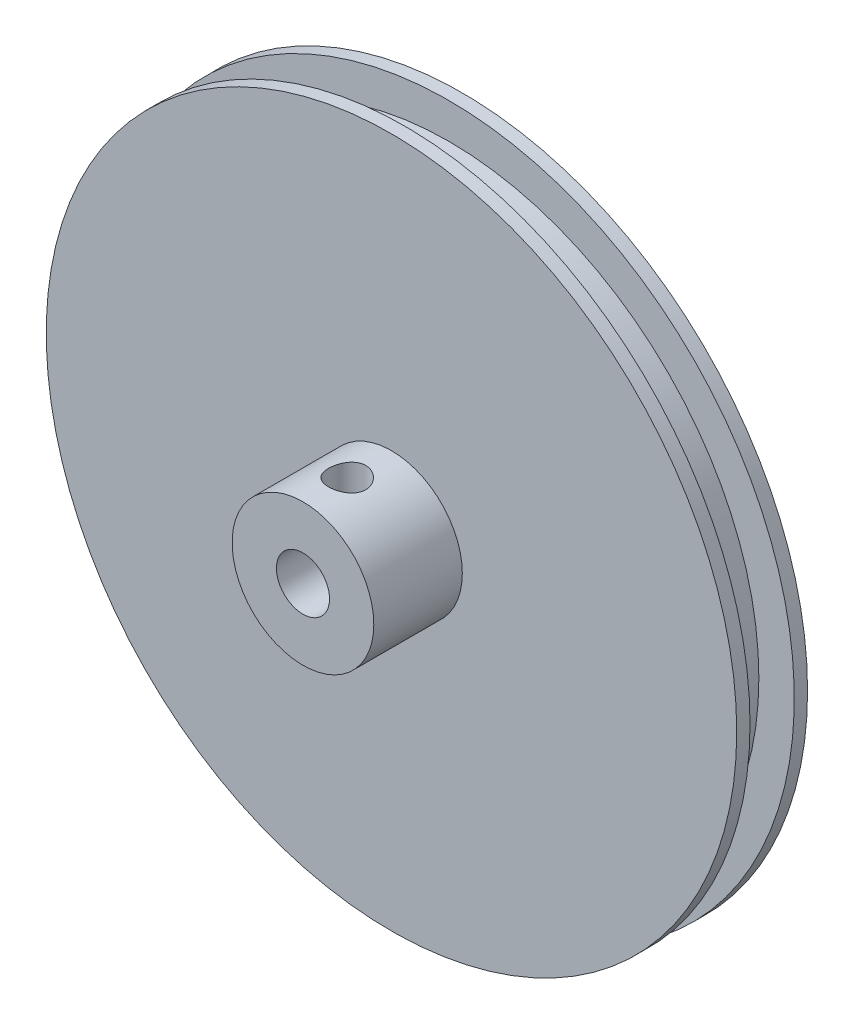
ISO-10303-21;
HEADER;
FILE_DESCRIPTION(('STEP AP214'),'2;1');
FILE_NAME('part.step','',(''),(''),'','','');
FILE_SCHEMA(('AUTOMOTIVE_DESIGN { 1 0 10303 214 1 1 1 1 }'));
ENDSEC;
DATA;
#1=APPLICATION_CONTEXT('core data for automotive mechanical design processes');
#2=APPLICATION_PROTOCOL_DEFINITION('international standard','automotive_design',2000,#1);
#3=PRODUCT_CONTEXT('',#1,'mechanical');
#4=PRODUCT('Part','Part','',(#3));
#5=PRODUCT_RELATED_PRODUCT_CATEGORY('part','',(#4));
#6=PRODUCT_DEFINITION_FORMATION('','',#4);
#7=PRODUCT_DEFINITION_CONTEXT('part definition',#1,'design');
#8=PRODUCT_DEFINITION('design','',#6,#7);
#9=PRODUCT_DEFINITION_SHAPE('','',#8);
#10=(LENGTH_UNIT() NAMED_UNIT(*) SI_UNIT(.MILLI.,.METRE.));
#11=(NAMED_UNIT(*) PLANE_ANGLE_UNIT() SI_UNIT($,.RADIAN.));
#12=(NAMED_UNIT(*) SI_UNIT($,.STERADIAN.) SOLID_ANGLE_UNIT());
#13=UNCERTAINTY_MEASURE_WITH_UNIT(LENGTH_MEASURE(1.E-05),#10,'distance_accuracy_value','');
#14=(GEOMETRIC_REPRESENTATION_CONTEXT(3) GLOBAL_UNCERTAINTY_ASSIGNED_CONTEXT((#13)) GLOBAL_UNIT_ASSIGNED_CONTEXT((#10,
#11,#12)) REPRESENTATION_CONTEXT('',''));
#15=CARTESIAN_POINT('',(0.,0.,0.));
#16=DIRECTION('',(0.,0.,1.));
#17=DIRECTION('',(1.,0.,0.));
#18=AXIS2_PLACEMENT_3D('',#15,#16,#17);
#19=CARTESIAN_POINT('',(0.,0.,8.));
#20=DIRECTION('',(0.,0.,-1.));
#21=DIRECTION('',(-1.,0.,0.));
#22=AXIS2_PLACEMENT_3D('',#19,#20,#21);
#23=CYLINDRICAL_SURFACE('',#22,39.);
#24=CARTESIAN_POINT('',(0.,0.,1.5));
#25=DIRECTION('',(0.,0.,-1.));
#26=DIRECTION('',(-1.,0.,0.));
#27=AXIS2_PLACEMENT_3D('',#24,#25,#26);
#28=CIRCLE('',#27,39.);
#29=CARTESIAN_POINT('',(-39.,0.,1.5));
#30=VERTEX_POINT('',#29);
#31=EDGE_CURVE('E55',#30,#30,#28,.T.);
#32=ORIENTED_EDGE('',*,*,#31,.T.);
#33=EDGE_LOOP('',(#32));
#34=FACE_BOUND('',#33,.T.);
#35=CARTESIAN_POINT('',(0.,0.,0.));
#36=DIRECTION('',(0.,0.,1.));
#37=DIRECTION('',(1.,0.,0.));
#38=AXIS2_PLACEMENT_3D('',#35,#36,#37);
#39=CIRCLE('',#38,39.);
#40=CARTESIAN_POINT('',(39.,0.,0.));
#41=VERTEX_POINT('',#40);
#42=EDGE_CURVE('E66',#41,#41,#39,.T.);
#43=ORIENTED_EDGE('',*,*,#42,.T.);
#44=EDGE_LOOP('',(#43));
#45=FACE_BOUND('',#44,.T.);
#46=ADVANCED_FACE('F51',(#34,#45),#23,.T.);
#47=CARTESIAN_POINT('',(0.,0.,6.5));
#48=DIRECTION('',(0.,0.,1.));
#49=DIRECTION('',(1.,0.,0.));
#50=AXIS2_PLACEMENT_3D('',#47,#48,#49);
#51=CIRCLE('',#50,39.);
#52=CARTESIAN_POINT('',(39.,0.,6.5));
#53=VERTEX_POINT('',#52);
#54=EDGE_CURVE('E74',#53,#53,#51,.T.);
#55=ORIENTED_EDGE('',*,*,#54,.T.);
#56=EDGE_LOOP('',(#55));
#57=FACE_BOUND('',#56,.T.);
#58=CARTESIAN_POINT('',(0.,0.,8.));
#59=DIRECTION('',(0.,0.,1.));
#60=DIRECTION('',(1.,0.,0.));
#61=AXIS2_PLACEMENT_3D('',#58,#59,#60);
#62=CIRCLE('',#61,39.);
#63=CARTESIAN_POINT('',(39.,0.,8.));
#64=VERTEX_POINT('',#63);
#65=EDGE_CURVE('E60',#64,#64,#62,.T.);
#66=ORIENTED_EDGE('',*,*,#65,.F.);
#67=EDGE_LOOP('',(#66));
#68=FACE_BOUND('',#67,.T.);
#69=ADVANCED_FACE('F53',(#57,#68),#23,.T.);
#70=CARTESIAN_POINT('',(0.,0.,8.));
#71=DIRECTION('',(0.,0.,1.));
#72=DIRECTION('',(1.,0.,0.));
#73=AXIS2_PLACEMENT_3D('',#70,#71,#72);
#74=PLANE('',#73);
#75=CARTESIAN_POINT('',(0.,0.,8.));
#76=DIRECTION('',(0.,0.,1.));
#77=DIRECTION('',(1.,0.,0.));
#78=AXIS2_PLACEMENT_3D('',#75,#76,#77);
#79=CIRCLE('',#78,8.);
#80=CARTESIAN_POINT('',(8.,0.,8.));
#81=VERTEX_POINT('',#80);
#82=EDGE_CURVE('E11',#81,#81,#79,.T.);
#83=ORIENTED_EDGE('',*,*,#82,.F.);
#84=EDGE_LOOP('',(#83));
#85=FACE_BOUND('',#84,.T.);
#86=ORIENTED_EDGE('',*,*,#65,.T.);
#87=EDGE_LOOP('',(#86));
#88=FACE_BOUND('',#87,.T.);
#89=ADVANCED_FACE('F135',(#85,#88),#74,.T.);
#90=CARTESIAN_POINT('',(0.,0.,0.));
#91=DIRECTION('',(0.,0.,1.));
#92=DIRECTION('',(1.,0.,0.));
#93=AXIS2_PLACEMENT_3D('',#90,#91,#92);
#94=PLANE('',#93);
#95=CARTESIAN_POINT('',(0.,0.,0.));
#96=DIRECTION('',(0.,0.,1.));
#97=DIRECTION('',(1.,0.,0.));
#98=AXIS2_PLACEMENT_3D('',#95,#96,#97);
#99=CIRCLE('',#98,3.);
#100=CARTESIAN_POINT('',(3.,0.,0.));
#101=VERTEX_POINT('',#100);
#102=EDGE_CURVE('E165',#101,#101,#99,.T.);
#103=ORIENTED_EDGE('',*,*,#102,.T.);
#104=EDGE_LOOP('',(#103));
#105=FACE_BOUND('',#104,.T.);
#106=ORIENTED_EDGE('',*,*,#42,.F.);
#107=EDGE_LOOP('',(#106));
#108=FACE_BOUND('',#107,.T.);
#109=ADVANCED_FACE('F140',(#105,#108),#94,.F.);
#110=CARTESIAN_POINT('',(0.,0.,18.));
#111=DIRECTION('',(0.,0.,-1.));
#112=DIRECTION('',(-1.,0.,0.));
#113=AXIS2_PLACEMENT_3D('',#110,#111,#112);
#114=CYLINDRICAL_SURFACE('',#113,8.);
#115=CARTESIAN_POINT('',(-2.10611885965794,7.71778876032463,13.));
#116=CARTESIAN_POINT('',(-2.10611593603416,7.71779083037099,12.8842440364444));
#117=CARTESIAN_POINT('',(-2.09651731243442,7.72042853052437,12.7684567648006));
#118=CARTESIAN_POINT('',(-2.05844605551307,7.73066461518365,12.5402213319275));
#119=CARTESIAN_POINT('',(-2.02996356893785,7.73826558940368,12.4277749459308));
#120=CARTESIAN_POINT('',(-1.95512090184782,7.75751131254223,12.2095558606227));
#121=CARTESIAN_POINT('',(-1.90878532998448,7.7691504930181,12.103774207166));
#122=CARTESIAN_POINT('',(-1.79962758395047,7.79515719027073,11.9014721397355));
#123=CARTESIAN_POINT('',(-1.73680427553817,7.80952489473216,11.8049523635386));
#124=CARTESIAN_POINT('',(-1.59482533800342,7.83976409858205,11.6215739970658));
#125=CARTESIAN_POINT('',(-1.51534228717463,7.85566163210705,11.5349731503495));
#126=CARTESIAN_POINT('',(-1.34300335499517,7.88695124472672,11.3761674013107));
#127=CARTESIAN_POINT('',(-1.25014612457769,7.90234327263797,11.3039639530222));
#128=CARTESIAN_POINT('',(-1.05191218091972,7.93118221700837,11.1749329893151));
#129=CARTESIAN_POINT('',(-0.94636384005828,7.94459531529715,11.1183609369056));
#130=CARTESIAN_POINT('',(-0.726843306551775,7.96767598247521,11.0238633941039));
#131=CARTESIAN_POINT('',(-0.612872492195318,7.97734416258936,10.9859348605473));
#132=CARTESIAN_POINT('',(-0.382430923024965,7.99166889495782,10.9306329796959));
#133=CARTESIAN_POINT('',(-0.266072084273707,7.99643209072107,10.9128213812563));
#134=CARTESIAN_POINT('',(-0.0319263328954628,8.00079257315074,10.8968809695057));
#135=CARTESIAN_POINT('',(0.0858603447399066,8.00039069864785,10.8987489601317));
#136=CARTESIAN_POINT('',(0.316470528685519,7.99455029662776,10.9218043997722));
#137=CARTESIAN_POINT('',(0.429344975437609,7.98923512964396,10.9425184706697));
#138=CARTESIAN_POINT('',(0.649959423051567,7.97432030195631,11.0019143022338));
#139=CARTESIAN_POINT('',(0.757699135443025,7.96472040084852,11.0405970710766));
#140=CARTESIAN_POINT('',(0.966203601972375,7.94213851572665,11.1352001799814));
#141=CARTESIAN_POINT('',(1.06689043870507,7.92912458538059,11.1912843086315));
#142=CARTESIAN_POINT('',(1.25758786242909,7.90112495892233,11.3189727843245));
#143=CARTESIAN_POINT('',(1.34759641966305,7.88613888907856,11.3905800747634));
#144=CARTESIAN_POINT('',(1.51720672687194,7.85530037034182,11.5498014980189));
#145=CARTESIAN_POINT('',(1.59641885989787,7.83943541085153,11.6378287191427));
#146=CARTESIAN_POINT('',(1.73904875830948,7.80903594493344,11.8260808163805));
#147=CARTESIAN_POINT('',(1.80246562129063,7.7945015145505,11.9263063889155));
#148=CARTESIAN_POINT('',(1.91198826987529,7.76836559186465,12.1369343288459));
#149=CARTESIAN_POINT('',(1.95799125688072,7.75678164439852,12.247392480406));
#150=CARTESIAN_POINT('',(2.03064475917892,7.73808146464248,12.4748540581175));
#151=CARTESIAN_POINT('',(2.05729990325061,7.73096416380702,12.5918559115342));
#152=CARTESIAN_POINT('',(2.08983520797632,7.72223196128711,12.8254475449143));
#153=CARTESIAN_POINT('',(2.09629539062858,7.72046348508539,12.9419508882309));
#154=CARTESIAN_POINT('',(2.08985275001794,7.72220997984579,13.1743723512661));
#155=CARTESIAN_POINT('',(2.07695191522604,7.72572440822787,13.2902905298571));
#156=CARTESIAN_POINT('',(2.03266433815781,7.73749177984536,13.5160376710957));
#157=CARTESIAN_POINT('',(2.00162344466205,7.74565600044142,13.6259395583753));
#158=CARTESIAN_POINT('',(1.9223249017826,7.76571497017705,13.838978996403));
#159=CARTESIAN_POINT('',(1.87406505615576,7.77761019517541,13.9421156822756));
#160=CARTESIAN_POINT('',(1.76051249557696,7.804104954312,14.1411311339708));
#161=CARTESIAN_POINT('',(1.69487762615926,7.8187568767749,14.2368075410799));
#162=CARTESIAN_POINT('',(1.54886546673231,7.84898484772338,14.4160033598884));
#163=CARTESIAN_POINT('',(1.46848549459947,7.86456106398803,14.4995205548705));
#164=CARTESIAN_POINT('',(1.29258847896621,7.89540326605623,14.6544195508956));
#165=CARTESIAN_POINT('',(1.19671168724163,7.91064847257701,14.7253977756426));
#166=CARTESIAN_POINT('',(0.994068276838299,7.9386569744585,14.8502527610098));
#167=CARTESIAN_POINT('',(0.887302236917366,7.95142040161978,14.9041304298903));
#168=CARTESIAN_POINT('',(0.666661870482597,7.97293818645152,14.9927663474238));
#169=CARTESIAN_POINT('',(0.55284749448831,7.98172217124312,15.0276662899873));
#170=CARTESIAN_POINT('',(0.320706449809214,7.99441326618079,15.0777711554553));
#171=CARTESIAN_POINT('',(0.202380753406219,7.99832142111316,15.0929802977043));
#172=CARTESIAN_POINT('',(-0.0316481468022682,8.00076800448047,15.1030143387478));
#173=CARTESIAN_POINT('',(-0.147324662666938,7.99946270175496,15.098432125983));
#174=CARTESIAN_POINT('',(-0.37619545435328,7.99197021363607,15.0703853950062));
#175=CARTESIAN_POINT('',(-0.489389818121485,7.98578320149747,15.0469215469141));
#176=CARTESIAN_POINT('',(-0.709393949636194,7.96924477818465,14.9821085817812));
#177=CARTESIAN_POINT('',(-0.816240361166675,7.95892063341483,14.9408764378317));
#178=CARTESIAN_POINT('',(-1.02155691009666,7.9351820841317,14.8418020599263));
#179=CARTESIAN_POINT('',(-1.12002589915758,7.92176725689336,14.783957553564));
#180=CARTESIAN_POINT('',(-1.30856638601103,7.89284453098574,14.65154658094));
#181=CARTESIAN_POINT('',(-1.39835318056205,7.8772913011799,14.5765846460611));
#182=CARTESIAN_POINT('',(-1.5642736297147,7.84603030690711,14.4128212896994));
#183=CARTESIAN_POINT('',(-1.64040372098833,7.83032250323299,14.3240162675208));
#184=CARTESIAN_POINT('',(-1.7784395201366,7.8001449754068,14.1328304414933));
#185=CARTESIAN_POINT('',(-1.84001080593285,7.78570841092911,14.0302025036915));
#186=CARTESIAN_POINT('',(-1.94493917363777,7.76016414815561,13.8156850713263));
#187=CARTESIAN_POINT('',(-1.98830851680539,7.74905421041565,13.7038018723385));
#188=CARTESIAN_POINT('',(-2.04972444100542,7.73301049608083,13.4935616327421));
#189=CARTESIAN_POINT('',(-2.07082364889355,7.7273475927386,13.3961411940639));
#190=CARTESIAN_POINT('',(-2.09902137315844,7.71973603142663,13.199154742253));
#191=CARTESIAN_POINT('',(-2.10612137495509,7.71778697939038,13.099588957891));
#192=CARTESIAN_POINT('',(-2.10611885965794,7.71778876032463,13.));
#193=B_SPLINE_CURVE_WITH_KNOTS('',3,(#115,#116,#117,#118,#119,#120,#121,#122,#123,#124,#125,
#126,#127,#128,#129,#130,#131,#132,#133,#134,#135,#136,#137,#138,#139,#140,#141,#142,#143,#144,
#145,#146,#147,#148,#149,#150,#151,#152,#153,#154,#155,#156,#157,#158,#159,#160,#161,#162,#163,
#164,#165,#166,#167,#168,#169,#170,#171,#172,#173,#174,#175,#176,#177,#178,#179,#180,#181,#182,
#183,#184,#185,#186,#187,#188,#189,#190,#191,#192),.UNSPECIFIED.,.T.,.F.,(4,2,2,2,2,2,2,2,2,2,2,
2,2,2,2,2,2,2,2,2,2,2,2,2,2,2,2,2,2,2,2,2,2,2,2,2,2,2,4),(0.,0.346901812495412,
0.693984774601701,1.04059102006554,1.38722111588191,1.74143920947592,2.0956930584579,
2.45543360174608,2.81511540540188,3.16680047974519,3.51842843956861,3.8614608951439,
4.20451259968872,4.55089656276601,4.89734626234308,5.25411055949775,5.61089523439248,
5.96975442024491,6.32852772428482,6.6768972656967,7.02523103030441,7.36713083024463,
7.70907425442379,8.05832960560818,8.40764854919863,8.76671324559394,9.12575886782476,
9.48208558579399,9.83833593743032,10.1839893363922,10.52963046846,10.8730301112332,
11.2164767500635,11.5688480068,11.9213110714784,12.2812190642816,12.6408842239052,
12.9393678205879,13.237819744236),.UNSPECIFIED.);
#194=CARTESIAN_POINT('',(-2.10611885965794,7.71778876032463,13.));
#195=VERTEX_POINT('',#194);
#196=EDGE_CURVE('E101',#195,#195,#193,.T.);
#197=ORIENTED_EDGE('',*,*,#196,.T.);
#198=EDGE_LOOP('',(#197));
#199=FACE_BOUND('',#198,.T.);
#200=CARTESIAN_POINT('',(0.,0.,18.));
#201=DIRECTION('',(0.,0.,1.));
#202=DIRECTION('',(1.,0.,0.));
#203=AXIS2_PLACEMENT_3D('',#200,#201,#202);
#204=CIRCLE('',#203,8.);
#205=CARTESIAN_POINT('',(8.,0.,18.));
#206=VERTEX_POINT('',#205);
#207=EDGE_CURVE('E69',#206,#206,#204,.T.);
#208=ORIENTED_EDGE('',*,*,#207,.F.);
#209=EDGE_LOOP('',(#208));
#210=FACE_BOUND('',#209,.T.);
#211=ORIENTED_EDGE('',*,*,#82,.T.);
#212=EDGE_LOOP('',(#211));
#213=FACE_BOUND('',#212,.T.);
#214=ADVANCED_FACE('F142',(#199,#210,#213),#114,.T.);
#215=CARTESIAN_POINT('',(0.,0.,18.));
#216=DIRECTION('',(0.,0.,1.));
#217=DIRECTION('',(1.,0.,0.));
#218=AXIS2_PLACEMENT_3D('',#215,#216,#217);
#219=PLANE('',#218);
#220=CARTESIAN_POINT('',(0.,0.,18.));
#221=DIRECTION('',(0.,0.,1.));
#222=DIRECTION('',(1.,0.,0.));
#223=AXIS2_PLACEMENT_3D('',#220,#221,#222);
#224=CIRCLE('',#223,3.);
#225=CARTESIAN_POINT('',(3.,0.,18.));
#226=VERTEX_POINT('',#225);
#227=EDGE_CURVE('E168',#226,#226,#224,.T.);
#228=ORIENTED_EDGE('',*,*,#227,.F.);
#229=EDGE_LOOP('',(#228));
#230=FACE_BOUND('',#229,.T.);
#231=ORIENTED_EDGE('',*,*,#207,.T.);
#232=EDGE_LOOP('',(#231));
#233=FACE_BOUND('',#232,.T.);
#234=ADVANCED_FACE('F148',(#230,#233),#219,.T.);
#235=CARTESIAN_POINT('',(0.,0.,0.));
#236=DIRECTION('',(0.,0.,1.));
#237=DIRECTION('',(1.,0.,0.));
#238=AXIS2_PLACEMENT_3D('',#235,#236,#237);
#239=CYLINDRICAL_SURFACE('',#238,3.);
#240=CARTESIAN_POINT('',(-2.10169772838254,2.14076310191289,13.));
#241=CARTESIAN_POINT('',(-2.10169375625308,2.14077095929547,13.1008011820973));
#242=CARTESIAN_POINT('',(-2.0943777365906,2.14802399069996,13.2016245271775));
#243=CARTESIAN_POINT('',(-2.06580578254674,2.17550153151482,13.3995326047588));
#244=CARTESIAN_POINT('',(-2.04451885433035,2.19575487934358,13.4966085155702));
#245=CARTESIAN_POINT('',(-1.989826644943,2.24542254760898,13.6834179233112));
#246=CARTESIAN_POINT('',(-1.95655740396004,2.27473352259943,13.7732205078483));
#247=CARTESIAN_POINT('',(-1.87921648582915,2.33903269019606,13.9457598105775));
#248=CARTESIAN_POINT('',(-1.83514405636555,2.37402127812416,14.028496036139));
#249=CARTESIAN_POINT('',(-1.7284886346901,2.45305175646765,14.2004173764852));
#250=CARTESIAN_POINT('',(-1.66401563321749,2.49760605595852,14.28819447928));
#251=CARTESIAN_POINT('',(-1.5221850485206,2.58649910184219,14.4529364017925));
#252=CARTESIAN_POINT('',(-1.44481160285715,2.63083751283466,14.5298876925825));
#253=CARTESIAN_POINT('',(-1.26389150089555,2.72296200972067,14.683558806651));
#254=CARTESIAN_POINT('',(-1.15813195461536,2.77009251387542,14.7581057788012));
#255=CARTESIAN_POINT('',(-0.931671508274706,2.85420493631398,14.8876232166201));
#256=CARTESIAN_POINT('',(-0.811001150578626,2.89120711660961,14.9426328339596));
#257=CARTESIAN_POINT('',(-0.592302754480655,2.94248262909899,15.0177936503767));
#258=CARTESIAN_POINT('',(-0.496921123709963,2.96019286391941,15.0433418796575));
#259=CARTESIAN_POINT('',(-0.302297708924922,2.98633968063089,15.0808262292855));
#260=CARTESIAN_POINT('',(-0.203059072683437,2.99478366689801,15.0927732182547));
#261=CARTESIAN_POINT('',(-0.00334668391707819,3.00166500770866,15.1023830942073));
#262=CARTESIAN_POINT('',(0.0971290903940952,3.00008292758235,15.1000182393086));
#263=CARTESIAN_POINT('',(0.296082205810905,2.98701861494219,15.0810856725687));
#264=CARTESIAN_POINT('',(0.394558981793993,2.97553362166874,15.0645140001219));
#265=CARTESIAN_POINT('',(0.584576344512786,2.94403548145534,15.01863278519));
#266=CARTESIAN_POINT('',(0.676223930127029,2.92422291691091,14.9896225343755));
#267=CARTESIAN_POINT('',(0.853158440344672,2.87758624655556,14.9202242192872));
#268=CARTESIAN_POINT('',(0.938444111227793,2.85076076340055,14.8798339198393));
#269=CARTESIAN_POINT('',(1.1106277231926,2.78851216003814,14.7839178739043));
#270=CARTESIAN_POINT('',(1.19663223251965,2.75246198658368,14.7272021615153));
#271=CARTESIAN_POINT('',(1.35844076373939,2.67631338332498,14.6029022739928));
#272=CARTESIAN_POINT('',(1.43423363633669,2.63621061104746,14.5353063934969));
#273=CARTESIAN_POINT('',(1.58758376775993,2.54730424683141,14.3774420434021));
#274=CARTESIAN_POINT('',(1.66303875167087,2.49822583097174,14.2852804059057));
#275=CARTESIAN_POINT('',(1.79793073853315,2.40296690080012,14.0884905044488));
#276=CARTESIAN_POINT('',(1.85737188046784,2.35678564005301,13.9838654719147));
#277=CARTESIAN_POINT('',(1.94674332255768,2.28314200159308,13.7885668890403));
#278=CARTESIAN_POINT('',(1.98032001950162,2.25382145811251,13.7002745145974));
#279=CARTESIAN_POINT('',(2.03565378050321,2.20397557657203,13.5177436758514));
#280=CARTESIAN_POINT('',(2.05743294918058,2.18343380538625,13.4235167035373));
#281=CARTESIAN_POINT('',(2.08796668237559,2.15426863963925,13.2300519695135));
#282=CARTESIAN_POINT('',(2.09658709695138,2.1457680639909,13.1307731233637));
#283=CARTESIAN_POINT('',(2.09954822424216,2.14287372119887,12.9318051712858));
#284=CARTESIAN_POINT('',(2.09389414282995,2.1484748112111,12.8321162281575));
#285=CARTESIAN_POINT('',(2.07063459635597,2.17086728230824,12.6498511717286));
#286=CARTESIAN_POINT('',(2.05479943351647,2.18599516640945,12.5668223220221));
#287=CARTESIAN_POINT('',(2.01387176754698,2.22375705786976,12.4048457954058));
#288=CARTESIAN_POINT('',(1.98876950460564,2.24639897621777,12.3259025215959));
#289=CARTESIAN_POINT('',(1.91640507741083,2.30880983478957,12.1369244178401));
#290=CARTESIAN_POINT('',(1.86427442517673,2.35162237335329,12.0297616470286));
#291=CARTESIAN_POINT('',(1.74397631825719,2.44217848124805,11.827087390352));
#292=CARTESIAN_POINT('',(1.67577751904419,2.48993158482319,11.7315992385862));
#293=CARTESIAN_POINT('',(1.52306039293768,2.58623223814499,11.5514749350504));
#294=CARTESIAN_POINT('',(1.43825837348485,2.63477777332761,11.4670775901343));
#295=CARTESIAN_POINT('',(1.25413457242381,2.72722001707938,11.3129662182214));
#296=CARTESIAN_POINT('',(1.15483444886402,2.7711234944079,11.2432306613411));
#297=CARTESIAN_POINT('',(0.960113484708132,2.84379633553161,11.1306777159149));
#298=CARTESIAN_POINT('',(0.866644240334808,2.87386434744443,11.0853337683013));
#299=CARTESIAN_POINT('',(0.671960924430798,2.92550580592872,11.0084497261879));
#300=CARTESIAN_POINT('',(0.570751594797907,2.94708440445638,10.9769012583481));
#301=CARTESIAN_POINT('',(0.362469450150195,2.97989616732642,10.9291632722633));
#302=CARTESIAN_POINT('',(0.255366453608703,2.99106955374433,10.9130624851156));
#303=CARTESIAN_POINT('',(0.0393871031655785,3.0016861024953,10.8976300219915));
#304=CARTESIAN_POINT('',(-0.0694885424426377,3.00113384040131,10.8982918049581));
#305=CARTESIAN_POINT('',(-0.274659360758908,2.98899686411999,10.9154313910822));
#306=CARTESIAN_POINT('',(-0.371153578864251,2.97848336578262,10.9303747224434));
#307=CARTESIAN_POINT('',(-0.559872691938091,2.94884234528464,10.9730513419441));
#308=CARTESIAN_POINT('',(-0.652096771061705,2.9297131844595,11.000787063169));
#309=CARTESIAN_POINT('',(-0.833442165333657,2.88347741772419,11.0689638806384));
#310=CARTESIAN_POINT('',(-0.922341799693916,2.85611495838439,11.1098158121005));
#311=CARTESIAN_POINT('',(-1.09210503691423,2.79561079119742,11.2023613529238));
#312=CARTESIAN_POINT('',(-1.17296708084377,2.76246796563998,11.2540570594649));
#313=CARTESIAN_POINT('',(-1.3378567515662,2.68692966412416,11.3758294470539));
#314=CARTESIAN_POINT('',(-1.42040195623773,2.64389775662703,11.4475163415319));
#315=CARTESIAN_POINT('',(-1.57312651325334,2.5559856438556,11.6023216991642));
#316=CARTESIAN_POINT('',(-1.64327944110889,2.51110173483857,11.6854639331693));
#317=CARTESIAN_POINT('',(-1.78037255561428,2.41624502854759,11.8761664066015));
#318=CARTESIAN_POINT('',(-1.84507190039808,2.36658220450346,11.9855104090036));
#319=CARTESIAN_POINT('',(-1.95465871186137,2.27691294042418,12.2172646071013));
#320=CARTESIAN_POINT('',(-1.99960623719485,2.2368773975487,12.339633768005));
#321=CARTESIAN_POINT('',(-2.05544647225353,2.18542497843176,12.5527183704789));
#322=CARTESIAN_POINT('',(-2.07268491272056,2.16892260443222,12.6405261896245));
#323=CARTESIAN_POINT('',(-2.09580239388575,2.14659747292998,12.8188867639319));
#324=CARTESIAN_POINT('',(-2.10170129717146,2.14075604238972,12.9094344367022));
#325=CARTESIAN_POINT('',(-2.10169772838254,2.14076310191289,13.));
#326=B_SPLINE_CURVE_WITH_KNOTS('',3,(#240,#241,#242,#243,#244,#245,#246,#247,#248,#249,#250,
#251,#252,#253,#254,#255,#256,#257,#258,#259,#260,#261,#262,#263,#264,#265,#266,#267,#268,#269,
#270,#271,#272,#273,#274,#275,#276,#277,#278,#279,#280,#281,#282,#283,#284,#285,#286,#287,#288,
#289,#290,#291,#292,#293,#294,#295,#296,#297,#298,#299,#300,#301,#302,#303,#304,#305,#306,#307,
#308,#309,#310,#311,#312,#313,#314,#315,#316,#317,#318,#319,#320,#321,#322,#323,#324,#325),
.UNSPECIFIED.,.T.,.F.,(4,2,2,2,2,2,2,2,2,2,2,2,2,2,2,2,2,2,2,2,2,2,2,2,2,2,2,2,2,2,2,2,2,2,2,2,
2,2,2,2,2,2,4),(0.,0.301973223435531,0.604618635711374,0.903931039140894,1.20326429210161,
1.55501769378841,1.90720684651705,2.31804977810942,2.7280646973405,3.02773360434289,
3.32716288032115,3.62717275157127,3.92726628739669,4.22051205037771,4.51381545043928,
4.84003888345372,5.16661565707934,5.55151589746291,5.9363165597808,6.23199289437156,
6.52711329718778,6.82522273911174,7.12322347697783,7.37980613638279,7.63665979487589,
8.01451127327345,8.39310602933113,8.77884561454897,9.16401474783142,9.48714146722313,
9.8100717876306,10.134846099452,10.4594936804375,10.7527707598947,11.0461036430495,
11.3497065387119,11.6533682052277,12.0045164637744,12.3564046795999,12.7636402272856,
13.1696287925793,13.4414153585327,13.7127254216916),.UNSPECIFIED.);
#327=CARTESIAN_POINT('',(-2.10169772838254,2.14076310191289,13.));
#328=VERTEX_POINT('',#327);
#329=EDGE_CURVE('E83',#328,#328,#326,.T.);
#330=ORIENTED_EDGE('',*,*,#329,.T.);
#331=EDGE_LOOP('',(#330));
#332=FACE_BOUND('',#331,.T.);
#333=ORIENTED_EDGE('',*,*,#102,.F.);
#334=EDGE_LOOP('',(#333));
#335=FACE_BOUND('',#334,.T.);
#336=ORIENTED_EDGE('',*,*,#227,.T.);
#337=EDGE_LOOP('',(#336));
#338=FACE_BOUND('',#337,.T.);
#339=ADVANCED_FACE('F114',(#332,#335,#338),#239,.F.);
#340=CARTESIAN_POINT('',(-0.00634191794263367,7.99999748625441,13.));
#341=DIRECTION('',(-0.000792739742829222,0.999999685781801,0.));
#342=DIRECTION('',(-0.999999685781801,-0.000792739742829222,0.));
#343=AXIS2_PLACEMENT_3D('',#340,#341,#342);
#344=CYLINDRICAL_SURFACE('',#343,2.09999999999999);
#345=ORIENTED_EDGE('',*,*,#329,.F.);
#346=EDGE_LOOP('',(#345));
#347=FACE_BOUND('',#346,.T.);
#348=ORIENTED_EDGE('',*,*,#196,.F.);
#349=EDGE_LOOP('',(#348));
#350=FACE_BOUND('',#349,.T.);
#351=ADVANCED_FACE('F109',(#347,#350),#344,.F.);
#352=CARTESIAN_POINT('',(-43.0000000000001,0.,1.5));
#353=DIRECTION('',(0.,0.,-1.));
#354=DIRECTION('',(-1.,0.,0.));
#355=AXIS2_PLACEMENT_3D('',#352,#353,#354);
#356=PLANE('',#355);
#357=CARTESIAN_POINT('',(0.,0.,1.5));
#358=DIRECTION('',(0.,0.,-1.));
#359=DIRECTION('',(-1.,0.,0.));
#360=AXIS2_PLACEMENT_3D('',#357,#358,#359);
#361=CIRCLE('',#360,35.0000000000001);
#362=CARTESIAN_POINT('',(-35.0000000000001,0.,1.5));
#363=VERTEX_POINT('',#362);
#364=EDGE_CURVE('E77',#363,#363,#361,.T.);
#365=ORIENTED_EDGE('',*,*,#364,.T.);
#366=EDGE_LOOP('',(#365));
#367=FACE_BOUND('',#366,.T.);
#368=ORIENTED_EDGE('',*,*,#31,.F.);
#369=EDGE_LOOP('',(#368));
#370=FACE_BOUND('',#369,.T.);
#371=ADVANCED_FACE('F113',(#367,#370),#356,.F.);
#372=CARTESIAN_POINT('',(-43.0000000000001,0.,6.5));
#373=DIRECTION('',(0.,0.,1.));
#374=DIRECTION('',(1.,0.,0.));
#375=AXIS2_PLACEMENT_3D('',#372,#373,#374);
#376=PLANE('',#375);
#377=CARTESIAN_POINT('',(0.,0.,6.5));
#378=DIRECTION('',(0.,0.,-1.));
#379=DIRECTION('',(-1.,0.,0.));
#380=AXIS2_PLACEMENT_3D('',#377,#378,#379);
#381=CIRCLE('',#380,35.0000000000001);
#382=CARTESIAN_POINT('',(-35.0000000000001,0.,6.5));
#383=VERTEX_POINT('',#382);
#384=EDGE_CURVE('E85',#383,#383,#381,.T.);
#385=ORIENTED_EDGE('',*,*,#384,.F.);
#386=EDGE_LOOP('',(#385));
#387=FACE_BOUND('',#386,.T.);
#388=ORIENTED_EDGE('',*,*,#54,.F.);
#389=EDGE_LOOP('',(#388));
#390=FACE_BOUND('',#389,.T.);
#391=ADVANCED_FACE('F120',(#387,#390),#376,.F.);
#392=CARTESIAN_POINT('',(0.,0.,0.));
#393=DIRECTION('',(0.,0.,-1.));
#394=DIRECTION('',(-1.,0.,0.));
#395=AXIS2_PLACEMENT_3D('',#392,#393,#394);
#396=CYLINDRICAL_SURFACE('',#395,35.0000000000001);
#397=ORIENTED_EDGE('',*,*,#364,.F.);
#398=EDGE_LOOP('',(#397));
#399=FACE_BOUND('',#398,.T.);
#400=ORIENTED_EDGE('',*,*,#384,.T.);
#401=EDGE_LOOP('',(#400));
#402=FACE_BOUND('',#401,.T.);
#403=ADVANCED_FACE('F116',(#399,#402),#396,.T.);
#404=CLOSED_SHELL('',(#46,#69,#89,#109,#214,#234,#339,#351,#371,#391,#403));
#405=MANIFOLD_SOLID_BREP('B2',#404);
#406=ADVANCED_BREP_SHAPE_REPRESENTATION('',(#18,#405),#14);
#407=SHAPE_DEFINITION_REPRESENTATION(#9,#406);
ENDSEC;
END-ISO-10303-21;
